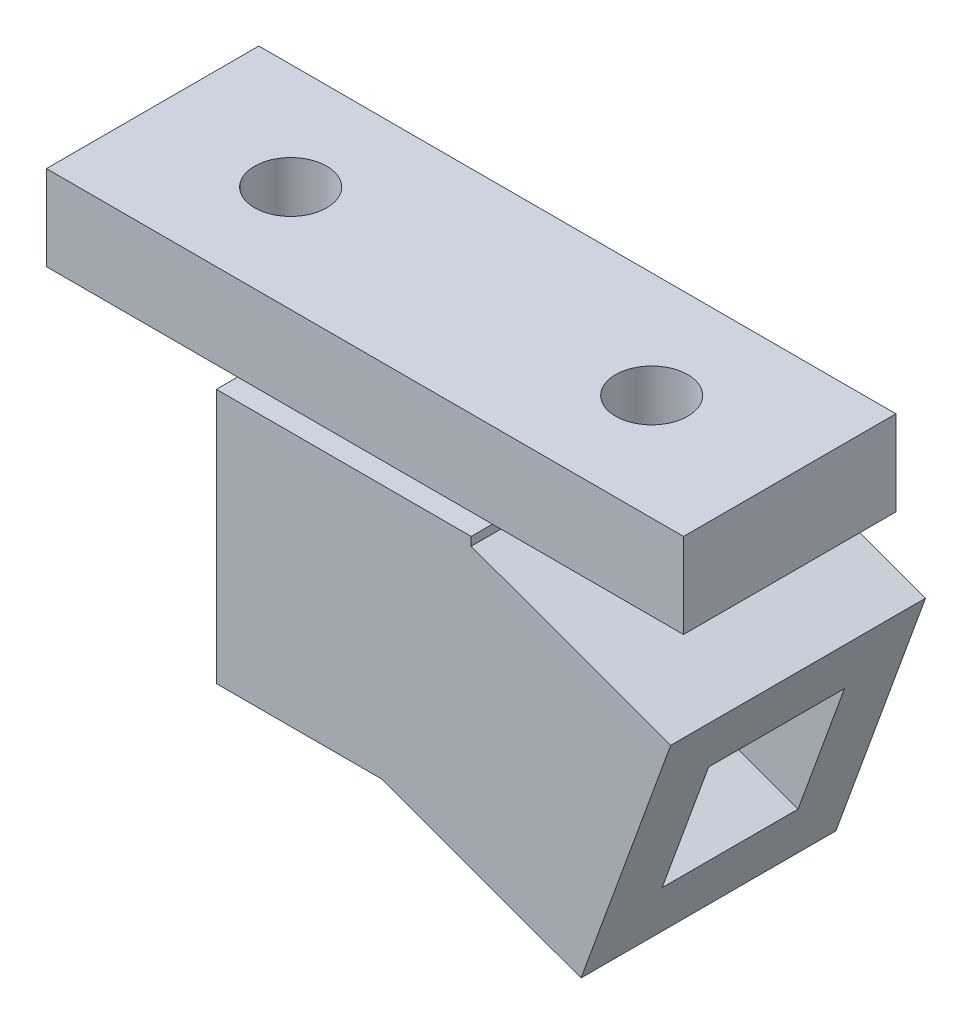
ISO-10303-21;
HEADER;
FILE_DESCRIPTION(('STEP AP214'),'2;1');
FILE_NAME('part.step','',(''),(''),'','','');
FILE_SCHEMA(('AUTOMOTIVE_DESIGN { 1 0 10303 214 1 1 1 1 }'));
ENDSEC;
DATA;
#1=APPLICATION_CONTEXT('core data for automotive mechanical design processes');
#2=APPLICATION_PROTOCOL_DEFINITION('international standard','automotive_design',2000,#1);
#3=PRODUCT_CONTEXT('',#1,'mechanical');
#4=PRODUCT('Part','Part','',(#3));
#5=PRODUCT_RELATED_PRODUCT_CATEGORY('part','',(#4));
#6=PRODUCT_DEFINITION_FORMATION('','',#4);
#7=PRODUCT_DEFINITION_CONTEXT('part definition',#1,'design');
#8=PRODUCT_DEFINITION('design','',#6,#7);
#9=PRODUCT_DEFINITION_SHAPE('','',#8);
#10=(LENGTH_UNIT() NAMED_UNIT(*) SI_UNIT(.MILLI.,.METRE.));
#11=(NAMED_UNIT(*) PLANE_ANGLE_UNIT() SI_UNIT($,.RADIAN.));
#12=(NAMED_UNIT(*) SI_UNIT($,.STERADIAN.) SOLID_ANGLE_UNIT());
#13=UNCERTAINTY_MEASURE_WITH_UNIT(LENGTH_MEASURE(1.E-05),#10,'distance_accuracy_value','');
#14=(GEOMETRIC_REPRESENTATION_CONTEXT(3) GLOBAL_UNCERTAINTY_ASSIGNED_CONTEXT((#13)) GLOBAL_UNIT_ASSIGNED_CONTEXT((#10,
#11,#12)) REPRESENTATION_CONTEXT('',''));
#15=CARTESIAN_POINT('',(0.,0.,0.));
#16=DIRECTION('',(0.,0.,1.));
#17=DIRECTION('',(1.,0.,0.));
#18=AXIS2_PLACEMENT_3D('',#15,#16,#17);
#19=CARTESIAN_POINT('',(0.,0.,0.));
#20=DIRECTION('',(0.,1.,0.));
#21=DIRECTION('',(0.,0.,1.));
#22=AXIS2_PLACEMENT_3D('',#19,#20,#21);
#23=PLANE('',#22);
#24=CARTESIAN_POINT('',(3.25,0.,-2.5));
#25=DIRECTION('',(0.,1.,0.));
#26=DIRECTION('',(0.,0.,1.));
#27=AXIS2_PLACEMENT_3D('',#24,#25,#26);
#28=CIRCLE('',#27,0.85);
#29=CARTESIAN_POINT('',(3.25,0.,-1.65));
#30=VERTEX_POINT('',#29);
#31=EDGE_CURVE('E332',#30,#30,#28,.T.);
#32=ORIENTED_EDGE('',*,*,#31,.T.);
#33=EDGE_LOOP('',(#32));
#34=FACE_BOUND('',#33,.T.);
#35=DIRECTION('',(0.,0.,-1.));
#36=VECTOR('',#35,1.);
#37=CARTESIAN_POINT('',(4.5,0.,0.499999999999999));
#38=LINE('',#37,#36);
#39=CARTESIAN_POINT('',(4.5,0.,0.));
#40=VERTEX_POINT('',#39);
#41=CARTESIAN_POINT('',(4.5,0.,-5.));
#42=VERTEX_POINT('',#41);
#43=EDGE_CURVE('E12',#40,#42,#38,.T.);
#44=ORIENTED_EDGE('',*,*,#43,.F.);
#45=DIRECTION('',(1.,0.,0.));
#46=VECTOR('',#45,1.);
#47=CARTESIAN_POINT('',(0.,0.,0.));
#48=LINE('',#47,#46);
#49=CARTESIAN_POINT('',(0.,0.,0.));
#50=VERTEX_POINT('',#49);
#51=EDGE_CURVE('E368',#50,#40,#48,.T.);
#52=ORIENTED_EDGE('',*,*,#51,.F.);
#53=DIRECTION('',(0.,0.,-1.));
#54=VECTOR('',#53,1.);
#55=CARTESIAN_POINT('',(0.,0.,0.));
#56=LINE('',#55,#54);
#57=CARTESIAN_POINT('',(0.,0.,-5.));
#58=VERTEX_POINT('',#57);
#59=EDGE_CURVE('E349',#50,#58,#56,.T.);
#60=ORIENTED_EDGE('',*,*,#59,.T.);
#61=DIRECTION('',(1.,0.,0.));
#62=VECTOR('',#61,1.);
#63=CARTESIAN_POINT('',(0.,0.,-5.));
#64=LINE('',#63,#62);
#65=EDGE_CURVE('E359',#58,#42,#64,.T.);
#66=ORIENTED_EDGE('',*,*,#65,.T.);
#67=EDGE_LOOP('',(#44,#52,#60,#66));
#68=FACE_BOUND('',#67,.T.);
#69=ADVANCED_FACE('F77',(#34,#68),#23,.F.);
#70=CARTESIAN_POINT('',(11.75,0.,-2.5));
#71=DIRECTION('',(0.,-1.,0.));
#72=DIRECTION('',(0.,0.,-1.));
#73=AXIS2_PLACEMENT_3D('',#70,#71,#72);
#74=CIRCLE('',#73,0.85);
#75=CARTESIAN_POINT('',(11.75,0.,-3.35));
#76=VERTEX_POINT('',#75);
#77=EDGE_CURVE('E327',#76,#76,#74,.T.);
#78=ORIENTED_EDGE('',*,*,#77,.F.);
#79=EDGE_LOOP('',(#78));
#80=FACE_BOUND('',#79,.T.);
#81=DIRECTION('',(0.,0.,1.));
#82=VECTOR('',#81,1.);
#83=CARTESIAN_POINT('',(10.5,0.,0.5));
#84=LINE('',#83,#82);
#85=CARTESIAN_POINT('',(10.5,0.,-5.));
#86=VERTEX_POINT('',#85);
#87=CARTESIAN_POINT('',(10.5,0.,0.));
#88=VERTEX_POINT('',#87);
#89=EDGE_CURVE('E87',#86,#88,#84,.T.);
#90=ORIENTED_EDGE('',*,*,#89,.F.);
#91=CARTESIAN_POINT('',(15.,0.,-5.));
#92=VERTEX_POINT('',#91);
#93=EDGE_CURVE('E340',#86,#92,#64,.T.);
#94=ORIENTED_EDGE('',*,*,#93,.T.);
#95=DIRECTION('',(0.,0.,-1.));
#96=VECTOR('',#95,1.);
#97=CARTESIAN_POINT('',(15.,0.,0.));
#98=LINE('',#97,#96);
#99=CARTESIAN_POINT('',(15.,0.,0.));
#100=VERTEX_POINT('',#99);
#101=EDGE_CURVE('E362',#100,#92,#98,.T.);
#102=ORIENTED_EDGE('',*,*,#101,.F.);
#103=EDGE_CURVE('E367',#88,#100,#48,.T.);
#104=ORIENTED_EDGE('',*,*,#103,.F.);
#105=EDGE_LOOP('',(#90,#94,#102,#104));
#106=FACE_BOUND('',#105,.T.);
#107=ADVANCED_FACE('F395',(#80,#106),#23,.F.);
#108=CARTESIAN_POINT('',(0.,2.,0.));
#109=DIRECTION('',(0.,1.,0.));
#110=DIRECTION('',(0.,0.,1.));
#111=AXIS2_PLACEMENT_3D('',#108,#109,#110);
#112=PLANE('',#111);
#113=CARTESIAN_POINT('',(11.75,2.,-2.5));
#114=DIRECTION('',(0.,-1.,0.));
#115=DIRECTION('',(0.,0.,-1.));
#116=AXIS2_PLACEMENT_3D('',#113,#114,#115);
#117=CIRCLE('',#116,0.85);
#118=CARTESIAN_POINT('',(11.75,2.,-3.35));
#119=VERTEX_POINT('',#118);
#120=EDGE_CURVE('E328',#119,#119,#117,.T.);
#121=ORIENTED_EDGE('',*,*,#120,.T.);
#122=EDGE_LOOP('',(#121));
#123=FACE_BOUND('',#122,.T.);
#124=DIRECTION('',(1.,0.,0.));
#125=VECTOR('',#124,1.);
#126=CARTESIAN_POINT('',(0.,2.,-5.));
#127=LINE('',#126,#125);
#128=CARTESIAN_POINT('',(0.,2.,-5.));
#129=VERTEX_POINT('',#128);
#130=CARTESIAN_POINT('',(15.,2.,-5.));
#131=VERTEX_POINT('',#130);
#132=EDGE_CURVE('E344',#129,#131,#127,.T.);
#133=ORIENTED_EDGE('',*,*,#132,.F.);
#134=DIRECTION('',(0.,0.,-1.));
#135=VECTOR('',#134,1.);
#136=CARTESIAN_POINT('',(0.,2.,0.));
#137=LINE('',#136,#135);
#138=CARTESIAN_POINT('',(0.,2.,0.));
#139=VERTEX_POINT('',#138);
#140=EDGE_CURVE('E355',#139,#129,#137,.T.);
#141=ORIENTED_EDGE('',*,*,#140,.F.);
#142=DIRECTION('',(1.,0.,0.));
#143=VECTOR('',#142,1.);
#144=CARTESIAN_POINT('',(0.,2.,0.));
#145=LINE('',#144,#143);
#146=CARTESIAN_POINT('',(15.,2.,0.));
#147=VERTEX_POINT('',#146);
#148=EDGE_CURVE('E352',#139,#147,#145,.T.);
#149=ORIENTED_EDGE('',*,*,#148,.T.);
#150=DIRECTION('',(0.,0.,-1.));
#151=VECTOR('',#150,1.);
#152=CARTESIAN_POINT('',(15.,2.,0.));
#153=LINE('',#152,#151);
#154=EDGE_CURVE('E348',#147,#131,#153,.T.);
#155=ORIENTED_EDGE('',*,*,#154,.T.);
#156=EDGE_LOOP('',(#133,#141,#149,#155));
#157=FACE_BOUND('',#156,.T.);
#158=CARTESIAN_POINT('',(3.25,2.,-2.5));
#159=DIRECTION('',(0.,1.,0.));
#160=DIRECTION('',(0.,0.,1.));
#161=AXIS2_PLACEMENT_3D('',#158,#159,#160);
#162=CIRCLE('',#161,0.85);
#163=CARTESIAN_POINT('',(3.25,2.,-1.65));
#164=VERTEX_POINT('',#163);
#165=EDGE_CURVE('E336',#164,#164,#162,.T.);
#166=ORIENTED_EDGE('',*,*,#165,.F.);
#167=EDGE_LOOP('',(#166));
#168=FACE_BOUND('',#167,.T.);
#169=ADVANCED_FACE('F460',(#123,#157,#168),#112,.T.);
#170=CARTESIAN_POINT('',(0.,2.,-5.));
#171=DIRECTION('',(0.,0.,-1.));
#172=DIRECTION('',(-1.,0.,0.));
#173=AXIS2_PLACEMENT_3D('',#170,#171,#172);
#174=PLANE('',#173);
#175=ORIENTED_EDGE('',*,*,#65,.F.);
#176=DIRECTION('',(0.,-1.,0.));
#177=VECTOR('',#176,1.);
#178=CARTESIAN_POINT('',(0.,2.,-5.));
#179=LINE('',#178,#177);
#180=EDGE_CURVE('E375',#129,#58,#179,.T.);
#181=ORIENTED_EDGE('',*,*,#180,.F.);
#182=ORIENTED_EDGE('',*,*,#132,.T.);
#183=DIRECTION('',(0.,-1.,0.));
#184=VECTOR('',#183,1.);
#185=CARTESIAN_POINT('',(15.,2.,-5.));
#186=LINE('',#185,#184);
#187=EDGE_CURVE('E81',#131,#92,#186,.T.);
#188=ORIENTED_EDGE('',*,*,#187,.T.);
#189=ORIENTED_EDGE('',*,*,#93,.F.);
#190=EDGE_CURVE('E363',#42,#86,#64,.T.);
#191=ORIENTED_EDGE('',*,*,#190,.F.);
#192=EDGE_LOOP('',(#175,#181,#182,#188,#189,#191));
#193=FACE_BOUND('',#192,.T.);
#194=ADVANCED_FACE('F79',(#193),#174,.T.);
#195=CARTESIAN_POINT('',(0.,2.,0.));
#196=DIRECTION('',(-1.,0.,0.));
#197=DIRECTION('',(0.,0.,1.));
#198=AXIS2_PLACEMENT_3D('',#195,#196,#197);
#199=PLANE('',#198);
#200=ORIENTED_EDGE('',*,*,#59,.F.);
#201=DIRECTION('',(0.,-1.,0.));
#202=VECTOR('',#201,1.);
#203=CARTESIAN_POINT('',(0.,2.,0.));
#204=LINE('',#203,#202);
#205=EDGE_CURVE('E378',#139,#50,#204,.T.);
#206=ORIENTED_EDGE('',*,*,#205,.F.);
#207=ORIENTED_EDGE('',*,*,#140,.T.);
#208=ORIENTED_EDGE('',*,*,#180,.T.);
#209=EDGE_LOOP('',(#200,#206,#207,#208));
#210=FACE_BOUND('',#209,.T.);
#211=ADVANCED_FACE('F465',(#210),#199,.T.);
#212=CARTESIAN_POINT('',(0.,2.,0.));
#213=DIRECTION('',(0.,0.,-1.));
#214=DIRECTION('',(-1.,0.,0.));
#215=AXIS2_PLACEMENT_3D('',#212,#213,#214);
#216=PLANE('',#215);
#217=ORIENTED_EDGE('',*,*,#51,.T.);
#218=EDGE_CURVE('E371',#40,#88,#48,.T.);
#219=ORIENTED_EDGE('',*,*,#218,.T.);
#220=ORIENTED_EDGE('',*,*,#103,.T.);
#221=DIRECTION('',(0.,-1.,0.));
#222=VECTOR('',#221,1.);
#223=CARTESIAN_POINT('',(15.,2.,0.));
#224=LINE('',#223,#222);
#225=EDGE_CURVE('E380',#147,#100,#224,.T.);
#226=ORIENTED_EDGE('',*,*,#225,.F.);
#227=ORIENTED_EDGE('',*,*,#148,.F.);
#228=ORIENTED_EDGE('',*,*,#205,.T.);
#229=EDGE_LOOP('',(#217,#219,#220,#226,#227,#228));
#230=FACE_BOUND('',#229,.T.);
#231=ADVANCED_FACE('F468',(#230),#216,.F.);
#232=CARTESIAN_POINT('',(15.,2.,0.));
#233=DIRECTION('',(-1.,0.,0.));
#234=DIRECTION('',(0.,0.,1.));
#235=AXIS2_PLACEMENT_3D('',#232,#233,#234);
#236=PLANE('',#235);
#237=ORIENTED_EDGE('',*,*,#101,.T.);
#238=ORIENTED_EDGE('',*,*,#187,.F.);
#239=ORIENTED_EDGE('',*,*,#154,.F.);
#240=ORIENTED_EDGE('',*,*,#225,.T.);
#241=EDGE_LOOP('',(#237,#238,#239,#240));
#242=FACE_BOUND('',#241,.T.);
#243=ADVANCED_FACE('F394',(#242),#236,.F.);
#244=CARTESIAN_POINT('',(3.25,2.,-2.5));
#245=DIRECTION('',(0.,-1.,0.));
#246=DIRECTION('',(0.,0.,-1.));
#247=AXIS2_PLACEMENT_3D('',#244,#245,#246);
#248=CYLINDRICAL_SURFACE('',#247,0.85);
#249=ORIENTED_EDGE('',*,*,#165,.T.);
#250=EDGE_LOOP('',(#249));
#251=FACE_BOUND('',#250,.T.);
#252=ORIENTED_EDGE('',*,*,#31,.F.);
#253=EDGE_LOOP('',(#252));
#254=FACE_BOUND('',#253,.T.);
#255=ADVANCED_FACE('F473',(#251,#254),#248,.F.);
#256=CARTESIAN_POINT('',(11.75,2.,-2.5));
#257=DIRECTION('',(0.,-1.,0.));
#258=DIRECTION('',(0.,0.,-1.));
#259=AXIS2_PLACEMENT_3D('',#256,#257,#258);
#260=CYLINDRICAL_SURFACE('',#259,0.85);
#261=ORIENTED_EDGE('',*,*,#120,.F.);
#262=EDGE_LOOP('',(#261));
#263=FACE_BOUND('',#262,.T.);
#264=ORIENTED_EDGE('',*,*,#77,.T.);
#265=EDGE_LOOP('',(#264));
#266=FACE_BOUND('',#265,.T.);
#267=ADVANCED_FACE('F477',(#263,#266),#260,.F.);
#268=CARTESIAN_POINT('',(0.,0.,0.));
#269=DIRECTION('',(0.,-1.,0.));
#270=DIRECTION('',(0.,0.,-1.));
#271=AXIS2_PLACEMENT_3D('',#268,#269,#270);
#272=PLANE('',#271);
#273=CARTESIAN_POINT('',(4.5,0.,-5.5));
#274=VERTEX_POINT('',#273);
#275=EDGE_CURVE('E90',#42,#274,#38,.T.);
#276=ORIENTED_EDGE('',*,*,#275,.F.);
#277=ORIENTED_EDGE('',*,*,#190,.T.);
#278=CARTESIAN_POINT('',(10.5,0.,-5.5));
#279=VERTEX_POINT('',#278);
#280=EDGE_CURVE('E305',#279,#86,#84,.T.);
#281=ORIENTED_EDGE('',*,*,#280,.F.);
#282=DIRECTION('',(1.,0.,0.));
#283=VECTOR('',#282,1.);
#284=CARTESIAN_POINT('',(10.5,0.,-5.5));
#285=LINE('',#284,#283);
#286=EDGE_CURVE('E286',#274,#279,#285,.T.);
#287=ORIENTED_EDGE('',*,*,#286,.F.);
#288=EDGE_LOOP('',(#276,#277,#281,#287));
#289=FACE_BOUND('',#288,.T.);
#290=ADVANCED_FACE('F402',(#289),#272,.F.);
#291=CARTESIAN_POINT('',(10.5,-6.,-5.5));
#292=DIRECTION('',(0.,0.,1.));
#293=DIRECTION('',(1.,0.,0.));
#294=AXIS2_PLACEMENT_3D('',#291,#292,#293);
#295=PLANE('',#294);
#296=DIRECTION('',(0.,1.,0.));
#297=VECTOR('',#296,1.);
#298=CARTESIAN_POINT('',(10.5,-6.,-5.5));
#299=LINE('',#298,#297);
#300=CARTESIAN_POINT('',(10.5,-0.200000000000001,-5.5));
#301=VERTEX_POINT('',#300);
#302=EDGE_CURVE('E324',#301,#279,#299,.T.);
#303=ORIENTED_EDGE('',*,*,#302,.F.);
#304=DIRECTION('',(-0.93969262078591,0.342020143325663,0.));
#305=VECTOR('',#304,1.);
#306=CARTESIAN_POINT('',(15.1984631039296,-1.91010071662832,-5.5));
#307=LINE('',#306,#305);
#308=CARTESIAN_POINT('',(15.1984631039296,-1.91010071662832,-5.5));
#309=VERTEX_POINT('',#308);
#310=EDGE_CURVE('E253',#309,#301,#307,.T.);
#311=ORIENTED_EDGE('',*,*,#310,.F.);
#312=DIRECTION('',(0.342020143325663,0.93969262078591,0.));
#313=VECTOR('',#312,1.);
#314=CARTESIAN_POINT('',(15.1984631039296,-1.91010071662832,-5.5));
#315=LINE('',#314,#313);
#316=CARTESIAN_POINT('',(13.0874357451856,-7.71010071662832,-5.5));
#317=VERTEX_POINT('',#316);
#318=EDGE_CURVE('E243',#317,#309,#315,.T.);
#319=ORIENTED_EDGE('',*,*,#318,.F.);
#320=DIRECTION('',(-0.93969262078591,0.342020143325663,0.));
#321=VECTOR('',#320,1.);
#322=CARTESIAN_POINT('',(13.0874357451856,-7.71010071662832,-5.5));
#323=LINE('',#322,#321);
#324=CARTESIAN_POINT('',(8.38897264125607,-6.,-5.5));
#325=VERTEX_POINT('',#324);
#326=EDGE_CURVE('E256',#317,#325,#323,.T.);
#327=ORIENTED_EDGE('',*,*,#326,.T.);
#328=DIRECTION('',(1.,0.,0.));
#329=VECTOR('',#328,1.);
#330=CARTESIAN_POINT('',(10.5,-6.,-5.5));
#331=LINE('',#330,#329);
#332=CARTESIAN_POINT('',(4.5,-6.,-5.5));
#333=VERTEX_POINT('',#332);
#334=EDGE_CURVE('E290',#333,#325,#331,.T.);
#335=ORIENTED_EDGE('',*,*,#334,.F.);
#336=DIRECTION('',(0.,1.,0.));
#337=VECTOR('',#336,1.);
#338=CARTESIAN_POINT('',(4.5,-6.,-5.5));
#339=LINE('',#338,#337);
#340=EDGE_CURVE('E300',#333,#274,#339,.T.);
#341=ORIENTED_EDGE('',*,*,#340,.T.);
#342=ORIENTED_EDGE('',*,*,#286,.T.);
#343=EDGE_LOOP('',(#303,#311,#319,#327,#335,#341,#342));
#344=FACE_BOUND('',#343,.T.);
#345=ADVANCED_FACE('F411',(#344),#295,.F.);
#346=CARTESIAN_POINT('',(10.5,-6.,0.5));
#347=DIRECTION('',(-1.,0.,0.));
#348=DIRECTION('',(0.,0.,1.));
#349=AXIS2_PLACEMENT_3D('',#346,#347,#348);
#350=PLANE('',#349);
#351=DIRECTION('',(0.,1.,0.));
#352=VECTOR('',#351,1.);
#353=CARTESIAN_POINT('',(10.5,-6.,0.5));
#354=LINE('',#353,#352);
#355=CARTESIAN_POINT('',(10.5,-0.200000000000001,0.5));
#356=VERTEX_POINT('',#355);
#357=CARTESIAN_POINT('',(10.5,0.,0.5));
#358=VERTEX_POINT('',#357);
#359=EDGE_CURVE('E321',#356,#358,#354,.T.);
#360=ORIENTED_EDGE('',*,*,#359,.F.);
#361=DIRECTION('',(0.,0.,-1.));
#362=VECTOR('',#361,1.);
#363=CARTESIAN_POINT('',(10.5,-0.200000000000001,6.67223108036028));
#364=LINE('',#363,#362);
#365=EDGE_CURVE('E277',#356,#301,#364,.T.);
#366=ORIENTED_EDGE('',*,*,#365,.T.);
#367=ORIENTED_EDGE('',*,*,#302,.T.);
#368=ORIENTED_EDGE('',*,*,#280,.T.);
#369=ORIENTED_EDGE('',*,*,#89,.T.);
#370=EDGE_CURVE('E304',#88,#358,#84,.T.);
#371=ORIENTED_EDGE('',*,*,#370,.T.);
#372=EDGE_LOOP('',(#360,#366,#367,#368,#369,#371));
#373=FACE_BOUND('',#372,.T.);
#374=ADVANCED_FACE('F406',(#373),#350,.F.);
#375=CARTESIAN_POINT('',(10.5,-6.,0.5));
#376=DIRECTION('',(0.,0.,-1.));
#377=DIRECTION('',(-1.,0.,0.));
#378=AXIS2_PLACEMENT_3D('',#375,#376,#377);
#379=PLANE('',#378);
#380=DIRECTION('',(-1.,0.,0.));
#381=VECTOR('',#380,1.);
#382=CARTESIAN_POINT('',(10.5,-6.,0.5));
#383=LINE('',#382,#381);
#384=CARTESIAN_POINT('',(8.38897264125607,-6.,0.499999999999999));
#385=VERTEX_POINT('',#384);
#386=CARTESIAN_POINT('',(4.5,-6.,0.499999999999999));
#387=VERTEX_POINT('',#386);
#388=EDGE_CURVE('E294',#385,#387,#383,.T.);
#389=ORIENTED_EDGE('',*,*,#388,.F.);
#390=DIRECTION('',(-0.93969262078591,0.342020143325663,0.));
#391=VECTOR('',#390,1.);
#392=CARTESIAN_POINT('',(13.0874357451856,-7.71010071662832,0.5));
#393=LINE('',#392,#391);
#394=CARTESIAN_POINT('',(13.0874357451856,-7.71010071662832,0.5));
#395=VERTEX_POINT('',#394);
#396=EDGE_CURVE('E260',#395,#385,#393,.T.);
#397=ORIENTED_EDGE('',*,*,#396,.F.);
#398=DIRECTION('',(-0.342020143325663,-0.93969262078591,0.));
#399=VECTOR('',#398,1.);
#400=CARTESIAN_POINT('',(15.1984631039296,-1.91010071662832,0.5));
#401=LINE('',#400,#399);
#402=CARTESIAN_POINT('',(15.1984631039296,-1.91010071662832,0.5));
#403=VERTEX_POINT('',#402);
#404=EDGE_CURVE('E236',#403,#395,#401,.T.);
#405=ORIENTED_EDGE('',*,*,#404,.F.);
#406=DIRECTION('',(-0.93969262078591,0.342020143325663,0.));
#407=VECTOR('',#406,1.);
#408=CARTESIAN_POINT('',(15.1984631039296,-1.91010071662832,0.5));
#409=LINE('',#408,#407);
#410=EDGE_CURVE('E249',#403,#356,#409,.T.);
#411=ORIENTED_EDGE('',*,*,#410,.T.);
#412=ORIENTED_EDGE('',*,*,#359,.T.);
#413=DIRECTION('',(-1.,0.,0.));
#414=VECTOR('',#413,1.);
#415=CARTESIAN_POINT('',(10.5,0.,0.5));
#416=LINE('',#415,#414);
#417=CARTESIAN_POINT('',(4.5,0.,0.499999999999999));
#418=VERTEX_POINT('',#417);
#419=EDGE_CURVE('E309',#358,#418,#416,.T.);
#420=ORIENTED_EDGE('',*,*,#419,.T.);
#421=DIRECTION('',(0.,1.,0.));
#422=VECTOR('',#421,1.);
#423=CARTESIAN_POINT('',(4.5,-6.,0.499999999999999));
#424=LINE('',#423,#422);
#425=EDGE_CURVE('E317',#387,#418,#424,.T.);
#426=ORIENTED_EDGE('',*,*,#425,.F.);
#427=EDGE_LOOP('',(#389,#397,#405,#411,#412,#420,#426));
#428=FACE_BOUND('',#427,.T.);
#429=ADVANCED_FACE('F430',(#428),#379,.F.);
#430=CARTESIAN_POINT('',(4.5,-6.,0.499999999999999));
#431=DIRECTION('',(1.,0.,0.));
#432=DIRECTION('',(0.,0.,-1.));
#433=AXIS2_PLACEMENT_3D('',#430,#431,#432);
#434=PLANE('',#433);
#435=EDGE_CURVE('E89',#418,#40,#38,.T.);
#436=ORIENTED_EDGE('',*,*,#435,.T.);
#437=ORIENTED_EDGE('',*,*,#43,.T.);
#438=ORIENTED_EDGE('',*,*,#275,.T.);
#439=ORIENTED_EDGE('',*,*,#340,.F.);
#440=DIRECTION('',(0.,0.,-1.));
#441=VECTOR('',#440,1.);
#442=CARTESIAN_POINT('',(4.5,-6.,0.499999999999999));
#443=LINE('',#442,#441);
#444=EDGE_CURVE('E297',#387,#333,#443,.T.);
#445=ORIENTED_EDGE('',*,*,#444,.F.);
#446=ORIENTED_EDGE('',*,*,#425,.T.);
#447=EDGE_LOOP('',(#436,#437,#438,#439,#445,#446));
#448=FACE_BOUND('',#447,.T.);
#449=ADVANCED_FACE('F418',(#448),#434,.F.);
#450=CARTESIAN_POINT('',(0.,-6.,0.));
#451=DIRECTION('',(0.,-1.,0.));
#452=DIRECTION('',(0.,0.,-1.));
#453=AXIS2_PLACEMENT_3D('',#450,#451,#452);
#454=PLANE('',#453);
#455=DIRECTION('',(0.,0.,-1.));
#456=VECTOR('',#455,1.);
#457=CARTESIAN_POINT('',(8.38897264125606,-6.,6.67223108036028));
#458=LINE('',#457,#456);
#459=EDGE_CURVE('E283',#385,#325,#458,.T.);
#460=ORIENTED_EDGE('',*,*,#459,.F.);
#461=ORIENTED_EDGE('',*,*,#388,.T.);
#462=ORIENTED_EDGE('',*,*,#444,.T.);
#463=ORIENTED_EDGE('',*,*,#334,.T.);
#464=EDGE_LOOP('',(#460,#461,#462,#463));
#465=FACE_BOUND('',#464,.T.);
#466=ADVANCED_FACE('F441',(#465),#454,.T.);
#467=ORIENTED_EDGE('',*,*,#218,.F.);
#468=ORIENTED_EDGE('',*,*,#435,.F.);
#469=ORIENTED_EDGE('',*,*,#419,.F.);
#470=ORIENTED_EDGE('',*,*,#370,.F.);
#471=EDGE_LOOP('',(#467,#468,#469,#470));
#472=FACE_BOUND('',#471,.T.);
#473=ADVANCED_FACE('F426',(#472),#272,.F.);
#474=CARTESIAN_POINT('',(14.0344751912729,-5.1081312231707,0.));
#475=DIRECTION('',(0.939692620785911,-0.342020143325663,0.));
#476=DIRECTION('',(0.342020143325663,0.939692620785911,0.));
#477=AXIS2_PLACEMENT_3D('',#474,#475,#476);
#478=PLANE('',#477);
#479=ORIENTED_EDGE('',*,*,#404,.T.);
#480=DIRECTION('',(0.,0.,-1.));
#481=VECTOR('',#480,1.);
#482=CARTESIAN_POINT('',(13.0874357451856,-7.71010071662832,0.5));
#483=LINE('',#482,#481);
#484=EDGE_CURVE('E240',#395,#317,#483,.T.);
#485=ORIENTED_EDGE('',*,*,#484,.T.);
#486=ORIENTED_EDGE('',*,*,#318,.T.);
#487=DIRECTION('',(0.,0.,1.));
#488=VECTOR('',#487,1.);
#489=CARTESIAN_POINT('',(15.1984631039296,-1.91010071662832,0.5));
#490=LINE('',#489,#488);
#491=EDGE_CURVE('E246',#309,#403,#490,.T.);
#492=ORIENTED_EDGE('',*,*,#491,.T.);
#493=EDGE_LOOP('',(#479,#485,#486,#492));
#494=FACE_BOUND('',#493,.T.);
#495=DIRECTION('',(0.,0.,-1.));
#496=VECTOR('',#495,1.);
#497=CARTESIAN_POINT('',(13.5957171952365,-6.31360890988577,-0.899999999999999));
#498=LINE('',#497,#496);
#499=CARTESIAN_POINT('',(13.5957171952365,-6.31360890988577,-0.899999999999999));
#500=VERTEX_POINT('',#499);
#501=CARTESIAN_POINT('',(13.5957171952365,-6.31360890988577,-4.1));
#502=VERTEX_POINT('',#501);
#503=EDGE_CURVE('E205',#500,#502,#498,.T.);
#504=ORIENTED_EDGE('',*,*,#503,.F.);
#505=DIRECTION('',(-0.342020143325663,-0.93969262078591,0.));
#506=VECTOR('',#505,1.);
#507=CARTESIAN_POINT('',(14.6901816538786,-3.30659252337086,-0.899999999999999));
#508=LINE('',#507,#506);
#509=CARTESIAN_POINT('',(14.6901816538786,-3.30659252337086,-0.899999999999999));
#510=VERTEX_POINT('',#509);
#511=EDGE_CURVE('E217',#510,#500,#508,.T.);
#512=ORIENTED_EDGE('',*,*,#511,.F.);
#513=DIRECTION('',(0.,0.,1.));
#514=VECTOR('',#513,1.);
#515=CARTESIAN_POINT('',(14.6901816538786,-3.30659252337086,-0.899999999999999));
#516=LINE('',#515,#514);
#517=CARTESIAN_POINT('',(14.6901816538786,-3.30659252337086,-4.1));
#518=VERTEX_POINT('',#517);
#519=EDGE_CURVE('E231',#518,#510,#516,.T.);
#520=ORIENTED_EDGE('',*,*,#519,.F.);
#521=DIRECTION('',(0.342020143325663,0.939692620785911,0.));
#522=VECTOR('',#521,1.);
#523=CARTESIAN_POINT('',(14.6901816538786,-3.30659252337086,-4.1));
#524=LINE('',#523,#522);
#525=EDGE_CURVE('E227',#502,#518,#524,.T.);
#526=ORIENTED_EDGE('',*,*,#525,.F.);
#527=EDGE_LOOP('',(#504,#512,#520,#526));
#528=FACE_BOUND('',#527,.T.);
#529=ADVANCED_FACE('F225',(#494,#528),#478,.T.);
#530=CARTESIAN_POINT('',(13.0874357451856,-7.71010071662832,0.5));
#531=DIRECTION('',(0.342020143325663,0.93969262078591,0.));
#532=DIRECTION('',(-0.93969262078591,0.342020143325663,0.));
#533=AXIS2_PLACEMENT_3D('',#530,#531,#532);
#534=PLANE('',#533);
#535=ORIENTED_EDGE('',*,*,#459,.T.);
#536=ORIENTED_EDGE('',*,*,#326,.F.);
#537=ORIENTED_EDGE('',*,*,#484,.F.);
#538=ORIENTED_EDGE('',*,*,#396,.T.);
#539=EDGE_LOOP('',(#535,#536,#537,#538));
#540=FACE_BOUND('',#539,.T.);
#541=ADVANCED_FACE('F442',(#540),#534,.F.);
#542=CARTESIAN_POINT('',(15.1984631039296,-1.91010071662832,0.5));
#543=DIRECTION('',(-0.342020143325663,-0.93969262078591,0.));
#544=DIRECTION('',(0.93969262078591,-0.342020143325663,0.));
#545=AXIS2_PLACEMENT_3D('',#542,#543,#544);
#546=PLANE('',#545);
#547=ORIENTED_EDGE('',*,*,#365,.F.);
#548=ORIENTED_EDGE('',*,*,#410,.F.);
#549=ORIENTED_EDGE('',*,*,#491,.F.);
#550=ORIENTED_EDGE('',*,*,#310,.T.);
#551=EDGE_LOOP('',(#547,#548,#549,#550));
#552=FACE_BOUND('',#551,.T.);
#553=ADVANCED_FACE('F435',(#552),#546,.F.);
#554=CARTESIAN_POINT('',(7.45662684577151,-2.71399021989106,0.));
#555=DIRECTION('',(-0.93969262078591,0.342020143325663,0.));
#556=DIRECTION('',(-0.342020143325663,-0.93969262078591,0.));
#557=AXIS2_PLACEMENT_3D('',#554,#555,#556);
#558=PLANE('',#557);
#559=DIRECTION('',(-0.342020143325663,-0.93969262078591,0.));
#560=VECTOR('',#559,1.);
#561=CARTESIAN_POINT('',(8.11233330837727,-0.912451520091217,-0.9));
#562=LINE('',#561,#560);
#563=CARTESIAN_POINT('',(8.11233330837727,-0.912451520091217,-0.9));
#564=VERTEX_POINT('',#563);
#565=CARTESIAN_POINT('',(7.01786884973515,-3.91946790660613,-0.9));
#566=VERTEX_POINT('',#565);
#567=EDGE_CURVE('E263',#564,#566,#562,.T.);
#568=ORIENTED_EDGE('',*,*,#567,.T.);
#569=DIRECTION('',(0.,0.,-1.));
#570=VECTOR('',#569,1.);
#571=CARTESIAN_POINT('',(7.01786884973515,-3.91946790660613,-4.1));
#572=LINE('',#571,#570);
#573=CARTESIAN_POINT('',(7.01786884973515,-3.91946790660613,-4.1));
#574=VERTEX_POINT('',#573);
#575=EDGE_CURVE('E208',#566,#574,#572,.T.);
#576=ORIENTED_EDGE('',*,*,#575,.T.);
#577=DIRECTION('',(0.342020143325663,0.939692620785911,0.));
#578=VECTOR('',#577,1.);
#579=CARTESIAN_POINT('',(8.11233330837727,-0.912451520091218,-4.1));
#580=LINE('',#579,#578);
#581=CARTESIAN_POINT('',(8.11233330837727,-0.912451520091218,-4.1));
#582=VERTEX_POINT('',#581);
#583=EDGE_CURVE('E268',#574,#582,#580,.T.);
#584=ORIENTED_EDGE('',*,*,#583,.T.);
#585=DIRECTION('',(0.,0.,1.));
#586=VECTOR('',#585,1.);
#587=CARTESIAN_POINT('',(8.11233330837727,-0.912451520091218,-4.1));
#588=LINE('',#587,#586);
#589=EDGE_CURVE('E214',#582,#564,#588,.T.);
#590=ORIENTED_EDGE('',*,*,#589,.T.);
#591=EDGE_LOOP('',(#568,#576,#584,#590));
#592=FACE_BOUND('',#591,.T.);
#593=ADVANCED_FACE('F449',(#592),#558,.F.);
#594=CARTESIAN_POINT('',(8.11233330837727,-0.912451520091218,-4.1));
#595=DIRECTION('',(0.,0.,-1.));
#596=DIRECTION('',(-1.,0.,0.));
#597=AXIS2_PLACEMENT_3D('',#594,#595,#596);
#598=PLANE('',#597);
#599=DIRECTION('',(0.93969262078591,-0.342020143325663,0.));
#600=VECTOR('',#599,1.);
#601=CARTESIAN_POINT('',(7.01786884973515,-3.91946790660613,-4.1));
#602=LINE('',#601,#600);
#603=EDGE_CURVE('E213',#574,#502,#602,.T.);
#604=ORIENTED_EDGE('',*,*,#603,.T.);
#605=ORIENTED_EDGE('',*,*,#525,.T.);
#606=DIRECTION('',(0.93969262078591,-0.342020143325663,0.));
#607=VECTOR('',#606,1.);
#608=CARTESIAN_POINT('',(8.11233330837727,-0.912451520091218,-4.1));
#609=LINE('',#608,#607);
#610=EDGE_CURVE('E278',#582,#518,#609,.T.);
#611=ORIENTED_EDGE('',*,*,#610,.F.);
#612=ORIENTED_EDGE('',*,*,#583,.F.);
#613=EDGE_LOOP('',(#604,#605,#611,#612));
#614=FACE_BOUND('',#613,.T.);
#615=ADVANCED_FACE('F502',(#614),#598,.F.);
#616=CARTESIAN_POINT('',(8.11233330837727,-0.912451520091218,-4.1));
#617=DIRECTION('',(0.342020143325663,0.93969262078591,0.));
#618=DIRECTION('',(-0.93969262078591,0.342020143325663,0.));
#619=AXIS2_PLACEMENT_3D('',#616,#617,#618);
#620=PLANE('',#619);
#621=ORIENTED_EDGE('',*,*,#610,.T.);
#622=ORIENTED_EDGE('',*,*,#519,.T.);
#623=DIRECTION('',(0.93969262078591,-0.342020143325663,0.));
#624=VECTOR('',#623,1.);
#625=CARTESIAN_POINT('',(8.11233330837727,-0.912451520091217,-0.9));
#626=LINE('',#625,#624);
#627=EDGE_CURVE('E219',#564,#510,#626,.T.);
#628=ORIENTED_EDGE('',*,*,#627,.F.);
#629=ORIENTED_EDGE('',*,*,#589,.F.);
#630=EDGE_LOOP('',(#621,#622,#628,#629));
#631=FACE_BOUND('',#630,.T.);
#632=ADVANCED_FACE('F499',(#631),#620,.F.);
#633=CARTESIAN_POINT('',(8.11233330837727,-0.912451520091217,-0.9));
#634=DIRECTION('',(0.,0.,1.));
#635=DIRECTION('',(1.,0.,0.));
#636=AXIS2_PLACEMENT_3D('',#633,#634,#635);
#637=PLANE('',#636);
#638=ORIENTED_EDGE('',*,*,#627,.T.);
#639=ORIENTED_EDGE('',*,*,#511,.T.);
#640=DIRECTION('',(0.93969262078591,-0.342020143325663,0.));
#641=VECTOR('',#640,1.);
#642=CARTESIAN_POINT('',(7.01786884973515,-3.91946790660613,-0.9));
#643=LINE('',#642,#641);
#644=EDGE_CURVE('E201',#566,#500,#643,.T.);
#645=ORIENTED_EDGE('',*,*,#644,.F.);
#646=ORIENTED_EDGE('',*,*,#567,.F.);
#647=EDGE_LOOP('',(#638,#639,#645,#646));
#648=FACE_BOUND('',#647,.T.);
#649=ADVANCED_FACE('F218',(#648),#637,.F.);
#650=CARTESIAN_POINT('',(7.01786884973515,-3.91946790660613,-4.1));
#651=DIRECTION('',(-0.342020143325663,-0.93969262078591,0.));
#652=DIRECTION('',(0.93969262078591,-0.342020143325663,0.));
#653=AXIS2_PLACEMENT_3D('',#650,#651,#652);
#654=PLANE('',#653);
#655=ORIENTED_EDGE('',*,*,#644,.T.);
#656=ORIENTED_EDGE('',*,*,#503,.T.);
#657=ORIENTED_EDGE('',*,*,#603,.F.);
#658=ORIENTED_EDGE('',*,*,#575,.F.);
#659=EDGE_LOOP('',(#655,#656,#657,#658));
#660=FACE_BOUND('',#659,.T.);
#661=ADVANCED_FACE('F203',(#660),#654,.F.);
#662=CLOSED_SHELL('',(#69,#107,#169,#194,#211,#231,#243,#255,#267,#290,#345,#374,#429,#449,#466,
#473,#529,#541,#553,#593,#615,#632,#649,#661));
#663=MANIFOLD_SOLID_BREP('B2',#662);
#664=ADVANCED_BREP_SHAPE_REPRESENTATION('',(#18,#663),#14);
#665=SHAPE_DEFINITION_REPRESENTATION(#9,#664);
ENDSEC;
END-ISO-10303-21;
